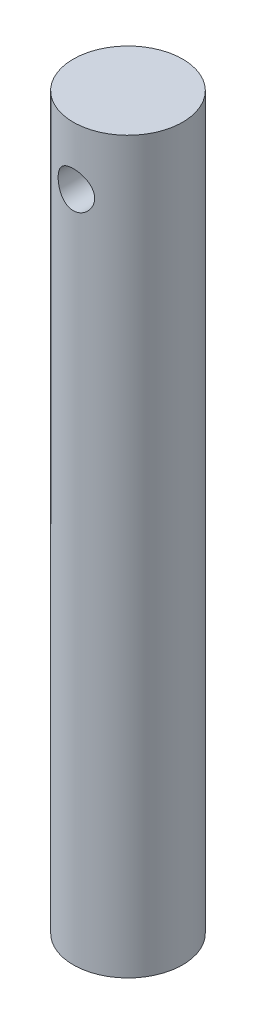
ISO-10303-21;
HEADER;
FILE_DESCRIPTION(('STEP AP214'),'2;1');
FILE_NAME('part.step','',(''),(''),'','','');
FILE_SCHEMA(('AUTOMOTIVE_DESIGN { 1 0 10303 214 1 1 1 1 }'));
ENDSEC;
DATA;
#1=APPLICATION_CONTEXT('core data for automotive mechanical design processes');
#2=APPLICATION_PROTOCOL_DEFINITION('international standard','automotive_design',2000,#1);
#3=PRODUCT_CONTEXT('',#1,'mechanical');
#4=PRODUCT('Part','Part','',(#3));
#5=PRODUCT_RELATED_PRODUCT_CATEGORY('part','',(#4));
#6=PRODUCT_DEFINITION_FORMATION('','',#4);
#7=PRODUCT_DEFINITION_CONTEXT('part definition',#1,'design');
#8=PRODUCT_DEFINITION('design','',#6,#7);
#9=PRODUCT_DEFINITION_SHAPE('','',#8);
#10=(LENGTH_UNIT() NAMED_UNIT(*) SI_UNIT(.MILLI.,.METRE.));
#11=(NAMED_UNIT(*) PLANE_ANGLE_UNIT() SI_UNIT($,.RADIAN.));
#12=(NAMED_UNIT(*) SI_UNIT($,.STERADIAN.) SOLID_ANGLE_UNIT());
#13=UNCERTAINTY_MEASURE_WITH_UNIT(LENGTH_MEASURE(1.E-05),#10,'distance_accuracy_value','');
#14=(GEOMETRIC_REPRESENTATION_CONTEXT(3) GLOBAL_UNCERTAINTY_ASSIGNED_CONTEXT((#13)) GLOBAL_UNIT_ASSIGNED_CONTEXT((#10,
#11,#12)) REPRESENTATION_CONTEXT('',''));
#15=CARTESIAN_POINT('',(0.,0.,0.));
#16=DIRECTION('',(0.,0.,1.));
#17=DIRECTION('',(1.,0.,0.));
#18=AXIS2_PLACEMENT_3D('',#15,#16,#17);
#19=CARTESIAN_POINT('',(0.,0.,0.));
#20=DIRECTION('',(0.,-1.,0.));
#21=DIRECTION('',(1.,0.,0.));
#22=AXIS2_PLACEMENT_3D('',#19,#20,#21);
#23=PLANE('',#22);
#24=CARTESIAN_POINT('',(0.,0.,0.));
#25=DIRECTION('',(0.,1.,0.));
#26=DIRECTION('',(-1.,0.,0.));
#27=AXIS2_PLACEMENT_3D('',#24,#25,#26);
#28=CIRCLE('',#27,4.75996);
#29=CARTESIAN_POINT('',(-4.75996000000002,0.,0.));
#30=VERTEX_POINT('',#29);
#31=EDGE_CURVE('E48',#30,#30,#28,.T.);
#32=ORIENTED_EDGE('',*,*,#31,.T.);
#33=EDGE_LOOP('',(#32));
#34=FACE_BOUND('',#33,.T.);
#35=ADVANCED_FACE('F34',(#34),#23,.F.);
#36=CARTESIAN_POINT('',(0.,0.,0.));
#37=DIRECTION('',(0.,1.,0.));
#38=DIRECTION('',(-1.,0.,0.));
#39=AXIS2_PLACEMENT_3D('',#36,#37,#38);
#40=CYLINDRICAL_SURFACE('',#39,4.75996);
#41=CARTESIAN_POINT('',(0.,-3.4925,-4.75996));
#42=CARTESIAN_POINT('',(-0.0866167195247513,-3.49249958799542,-4.7599602495705));
#43=CARTESIAN_POINT('',(-0.173230934056387,-3.49961198942618,-4.75757396727824));
#44=CARTESIAN_POINT('',(-0.343908018430015,-3.52778648720024,-4.74828970267775));
#45=CARTESIAN_POINT('',(-0.427970625172633,-3.54885001698566,-4.74139125675736));
#46=CARTESIAN_POINT('',(-0.591059224324681,-3.60412434674444,-4.72383219371372));
#47=CARTESIAN_POINT('',(-0.670093385121266,-3.63831315514545,-4.71317787203644));
#48=CARTESIAN_POINT('',(-0.821305793047321,-3.71876809951329,-4.6891944510313));
#49=CARTESIAN_POINT('',(-0.893482681657747,-3.76503662185925,-4.67586482331017));
#50=CARTESIAN_POINT('',(-1.03143379155772,-3.87002205547875,-4.64741669977021));
#51=CARTESIAN_POINT('',(-1.09693747308899,-3.92908276954941,-4.63225532156355));
#52=CARTESIAN_POINT('',(-1.21731714079682,-4.05724508793517,-4.60208831466731));
#53=CARTESIAN_POINT('',(-1.27219078327101,-4.12634890067978,-4.58708272101361));
#54=CARTESIAN_POINT('',(-1.3712978026377,-4.27507231678816,-4.55845430376394));
#55=CARTESIAN_POINT('',(-1.41517936666863,-4.35493739058951,-4.54488372719859));
#56=CARTESIAN_POINT('',(-1.48877256652655,-4.52143954417915,-4.52131393121735));
#57=CARTESIAN_POINT('',(-1.51848853179125,-4.60807454543762,-4.51131362085446));
#58=CARTESIAN_POINT('',(-1.56189187961738,-4.78258086082235,-4.49646821367011));
#59=CARTESIAN_POINT('',(-1.57608622515613,-4.87031184416575,-4.49146056836381));
#60=CARTESIAN_POINT('',(-1.58962821197511,-5.04704210546593,-4.48668672970883));
#61=CARTESIAN_POINT('',(-1.58898044686916,-5.13604098248901,-4.48691891463922));
#62=CARTESIAN_POINT('',(-1.57325020435077,-5.30845550222183,-4.49245606452615));
#63=CARTESIAN_POINT('',(-1.55882951805553,-5.39194028934832,-4.49752844722438));
#64=CARTESIAN_POINT('',(-1.51704244917971,-5.55522973151717,-4.51179386159576));
#65=CARTESIAN_POINT('',(-1.48967451508364,-5.6350339442448,-4.52098738711342));
#66=CARTESIAN_POINT('',(-1.42233688179104,-5.79019983815728,-4.54262483531957));
#67=CARTESIAN_POINT('',(-1.38217119234764,-5.8654691913205,-4.55511875572088));
#68=CARTESIAN_POINT('',(-1.2905142737802,-6.00840869279547,-4.58192831667857));
#69=CARTESIAN_POINT('',(-1.23901977052758,-6.07607663567356,-4.59624448337531));
#70=CARTESIAN_POINT('',(-1.12298918510662,-6.20561092260434,-4.62600031021356));
#71=CARTESIAN_POINT('',(-1.05791213451394,-6.26698917835125,-4.64145958257259));
#72=CARTESIAN_POINT('',(-0.91819858254943,-6.3780885737463,-4.67110522199185));
#73=CARTESIAN_POINT('',(-0.843561163463844,-6.42780859300466,-4.68529146662967));
#74=CARTESIAN_POINT('',(-0.685809471313347,-6.51457369214864,-4.71097921452677));
#75=CARTESIAN_POINT('',(-0.602618310734797,-6.55148786665215,-4.72245262894315));
#76=CARTESIAN_POINT('',(-0.430732846708632,-6.61064643917101,-4.74121802273391));
#77=CARTESIAN_POINT('',(-0.342040468782749,-6.63289593872829,-4.74851145612331));
#78=CARTESIAN_POINT('',(-0.16580213902212,-6.66122856605369,-4.75785418986708));
#79=CARTESIAN_POINT('',(-0.0783734075786698,-6.66797122761589,-4.7601172901641));
#80=CARTESIAN_POINT('',(0.0963837449657619,-6.66697768988067,-4.75978567339283));
#81=CARTESIAN_POINT('',(0.183712180522995,-6.65924393749343,-4.75719177728984));
#82=CARTESIAN_POINT('',(0.353149236983503,-6.63003888350566,-4.7475787263025));
#83=CARTESIAN_POINT('',(0.435335789761169,-6.60897251749676,-4.74069009912311));
#84=CARTESIAN_POINT('',(0.594974868737595,-6.55420662263395,-4.72331205407193));
#85=CARTESIAN_POINT('',(0.672426789656163,-6.52050548244946,-4.71282217694203));
#86=CARTESIAN_POINT('',(0.822670339360189,-6.44044337937334,-4.68896305455337));
#87=CARTESIAN_POINT('',(0.895285661765883,-6.39377256455262,-4.67552529290299));
#88=CARTESIAN_POINT('',(1.03186841501554,-6.28945991919544,-4.64729370008735));
#89=CARTESIAN_POINT('',(1.09583319199442,-6.2318147348775,-4.63249945509735));
#90=CARTESIAN_POINT('',(1.21632727414802,-6.1040883037758,-4.60236918705928));
#91=CARTESIAN_POINT('',(1.27238600285149,-6.03356064320417,-4.58703913115184));
#92=CARTESIAN_POINT('',(1.3719309367172,-5.88377055013686,-4.5582582795399));
#93=CARTESIAN_POINT('',(1.41541703393749,-5.80450804265648,-4.54480749997039));
#94=CARTESIAN_POINT('',(1.48838160645785,-5.63946177926065,-4.52143925554727));
#95=CARTESIAN_POINT('',(1.5178881412705,-5.55369149078483,-4.51151472298198));
#96=CARTESIAN_POINT('',(1.56190562078344,-5.37799198734181,-4.49646769151321));
#97=CARTESIAN_POINT('',(1.576423330516,-5.28806466776673,-4.49134302634229));
#98=CARTESIAN_POINT('',(1.58952315640421,-5.11157949703807,-4.48672247008384));
#99=CARTESIAN_POINT('',(1.58888641934569,-5.0250862074536,-4.48695065346133));
#100=CARTESIAN_POINT('',(1.57361821544084,-4.85350761799404,-4.49232778311328));
#101=CARTESIAN_POINT('',(1.55898758322144,-4.76842223445621,-4.49747643592));
#102=CARTESIAN_POINT('',(1.51670005140762,-4.60368622760059,-4.51190883125916));
#103=CARTESIAN_POINT('',(1.48929638922858,-4.52396298573912,-4.52111200280964));
#104=CARTESIAN_POINT('',(1.42244597018922,-4.37018495573297,-4.54258664843486));
#105=CARTESIAN_POINT('',(1.38299653837148,-4.29613143121358,-4.55485880391732));
#106=CARTESIAN_POINT('',(1.29116405090423,-4.15228934477753,-4.58175684726942));
#107=CARTESIAN_POINT('',(1.23829138132248,-4.08282829895615,-4.5964621235641));
#108=CARTESIAN_POINT('',(1.12194074304967,-3.95351228368728,-4.62623710837008));
#109=CARTESIAN_POINT('',(1.05845977427407,-3.89366004107635,-4.64130691893965));
#110=CARTESIAN_POINT('',(0.919719265237504,-3.78290604957769,-4.67081911104141));
#111=CARTESIAN_POINT('',(0.844096703668593,-3.73244482744334,-4.6852140457568));
#112=CARTESIAN_POINT('',(0.684968758642292,-3.64500529615142,-4.7111062779919));
#113=CARTESIAN_POINT('',(0.601465387389251,-3.60802355694443,-4.72260431243954));
#114=CARTESIAN_POINT('',(0.432750295008049,-3.55013712229937,-4.7409726922979));
#115=CARTESIAN_POINT('',(0.347778362268229,-3.528592461366,-4.74802557224235));
#116=CARTESIAN_POINT('',(0.175202941738251,-3.49977608549255,-4.75751846096947));
#117=CARTESIAN_POINT('',(0.0876001897687103,-3.4925004166826,-4.75995974759581));
#118=CARTESIAN_POINT('',(0.,-3.4925,-4.75996));
#119=B_SPLINE_CURVE_WITH_KNOTS('',3,(#41,#42,#43,#44,#45,#46,#47,#48,#49,#50,#51,#52,#53,#54,
#55,#56,#57,#58,#59,#60,#61,#62,#63,#64,#65,#66,#67,#68,#69,#70,#71,#72,#73,#74,#75,#76,#77,#78,
#79,#80,#81,#82,#83,#84,#85,#86,#87,#88,#89,#90,#91,#92,#93,#94,#95,#96,#97,#98,#99,#100,#101,
#102,#103,#104,#105,#106,#107,#108,#109,#110,#111,#112,#113,#114,#115,#116,#117,#118),
.UNSPECIFIED.,.T.,.F.,(4,2,2,2,2,2,2,2,2,2,2,2,2,2,2,2,2,2,2,2,2,2,2,2,2,2,2,2,2,2,2,2,2,2,2,2,
2,2,4),(0.,0.259527793077378,0.519082256097486,0.778203717034866,1.03737640688104,
1.3046475584383,1.571977570821,1.84700395271951,2.12194622421526,2.38761220063683,
2.65319595489767,2.90662838722251,3.16009119696727,3.41763899393394,3.67526132252981,
3.94634876125789,4.21746224159406,4.49127066865636,4.76498379299408,5.02682119937416,
5.2886143520624,5.54281471756854,5.79704751263995,6.05797151879716,6.31897539204019,
6.59185177974722,6.8647305101567,7.13705917848909,7.40926488063437,7.66747143550969,
7.92566259133403,8.1789394343194,8.43227256246703,8.69666969255752,8.96114172252486,
9.23593636013089,9.51066102336782,9.77320832784411,10.0356828714262),.UNSPECIFIED.);
#120=CARTESIAN_POINT('',(0.,-3.4925,-4.75996));
#121=VERTEX_POINT('',#120);
#122=EDGE_CURVE('E10',#121,#121,#119,.T.);
#123=ORIENTED_EDGE('',*,*,#122,.T.);
#124=EDGE_LOOP('',(#123));
#125=FACE_BOUND('',#124,.T.);
#126=CARTESIAN_POINT('',(1.58750000000002,-5.08000000000001,4.48743389384178));
#127=CARTESIAN_POINT('',(1.58750041901613,-5.16646528898974,4.48743360067506));
#128=CARTESIAN_POINT('',(1.58041195200963,-5.25292804294253,4.48996026463772));
#129=CARTESIAN_POINT('',(1.55234115930635,-5.42329181755565,4.49974132931377));
#130=CARTESIAN_POINT('',(1.53135655729154,-5.5071924161548,4.50699650459885));
#131=CARTESIAN_POINT('',(1.47631268883548,-5.66993624893454,4.52532338274428));
#132=CARTESIAN_POINT('',(1.4422790686933,-5.74878905143511,4.53638759506562));
#133=CARTESIAN_POINT('',(1.36219082839153,-5.8996912467871,4.56107498532142));
#134=CARTESIAN_POINT('',(1.31613355153163,-5.97173913125319,4.57469872861313));
#135=CARTESIAN_POINT('',(1.21137300267656,-6.1098083558927,4.60356856610916));
#136=CARTESIAN_POINT('',(1.15227829884873,-6.17552431006498,4.61885512232936));
#137=CARTESIAN_POINT('',(1.0239557297068,-6.2963213710826,4.64898617204141));
#138=CARTESIAN_POINT('',(0.954726238322307,-6.35140076805645,4.66383059413447));
#139=CARTESIAN_POINT('',(0.805865694398201,-6.45074725528349,4.69187334416678));
#140=CARTESIAN_POINT('',(0.726010170110219,-6.49469431946487,4.70501854306647));
#141=CARTESIAN_POINT('',(0.559526484950673,-6.5684110027263,4.72770494083655));
#142=CARTESIAN_POINT('',(0.472900158769256,-6.59818444704606,4.7372471119642));
#143=CARTESIAN_POINT('',(0.29853579439419,-6.64167297152234,4.75136569955225));
#144=CARTESIAN_POINT('',(0.210941548887595,-6.65591121193001,4.75610348704641));
#145=CARTESIAN_POINT('',(0.0344876629032518,-6.6695886702883,4.7606523316364));
#146=CARTESIAN_POINT('',(-0.0543716451660644,-6.66903170663425,4.76046465991123));
#147=CARTESIAN_POINT('',(-0.227130041675757,-6.65346628052013,4.75529305327101));
#148=CARTESIAN_POINT('',(-0.311086900701173,-6.63902607511876,4.75049771978295));
#149=CARTESIAN_POINT('',(-0.475309124115977,-6.5970438675882,4.73688643497004));
#150=CARTESIAN_POINT('',(-0.555574237843649,-6.56950097725032,4.72807021107755));
#151=CARTESIAN_POINT('',(-0.711376487491142,-6.50176372136684,4.70716767018348));
#152=CARTESIAN_POINT('',(-0.786837562895247,-6.46140773781979,4.69503987244329));
#153=CARTESIAN_POINT('',(-0.930084597418818,-6.36932311681637,4.66877639587625));
#154=CARTESIAN_POINT('',(-0.997868412771482,-6.31759131462653,4.65464015869301));
#155=CARTESIAN_POINT('',(-1.12721672796313,-6.20136058124893,4.62506348170808));
#156=CARTESIAN_POINT('',(-1.18833756305751,-6.13637485356465,4.60959297473389));
#157=CARTESIAN_POINT('',(-1.29895732759612,-5.99694446353938,4.5796529647333));
#158=CARTESIAN_POINT('',(-1.34845446197045,-5.92249834294441,4.56518361656078));
#159=CARTESIAN_POINT('',(-1.43503695119687,-5.76485298249514,4.53871955824774));
#160=CARTESIAN_POINT('',(-1.47193490243712,-5.6815438954696,4.52676315113148));
#161=CARTESIAN_POINT('',(-1.53102830126491,-5.50939596888282,4.5071224373186));
#162=CARTESIAN_POINT('',(-1.55322991857272,-5.42055946696281,4.49943633810684));
#163=CARTESIAN_POINT('',(-1.58139666250081,-5.24417622188188,4.48961218442888));
#164=CARTESIAN_POINT('',(-1.58804973108773,-5.15675239946922,4.48723926210829));
#165=CARTESIAN_POINT('',(-1.58687932965386,-4.98202354890091,4.48765362110394));
#166=CARTESIAN_POINT('',(-1.57905849259145,-4.89471850202986,4.49043996389467));
#167=CARTESIAN_POINT('',(-1.54978044443803,-4.72583683135346,4.50062474599677));
#168=CARTESIAN_POINT('',(-1.52880158304157,-4.64416646316483,4.50786123073396));
#169=CARTESIAN_POINT('',(-1.47437713038817,-4.48552163437658,4.52595271623477));
#170=CARTESIAN_POINT('',(-1.44092932755795,-4.40854800964224,4.53680835887988));
#171=CARTESIAN_POINT('',(-1.36130973104102,-4.25877374369565,4.56134169113666));
#172=CARTESIAN_POINT('',(-1.31476773765978,-4.18618312949783,4.57509802358186));
#173=CARTESIAN_POINT('',(-1.21070036339341,-4.04959342376906,4.60373020633471));
#174=CARTESIAN_POINT('',(-1.15317174143191,-3.98559687701659,4.61860638621298));
#175=CARTESIAN_POINT('',(-1.02547322604261,-3.86482569042789,4.6486689224333));
#176=CARTESIAN_POINT('',(-0.954827880877011,-3.80854743956438,4.6638357007562));
#177=CARTESIAN_POINT('',(-0.804723279416898,-3.70861228631785,4.69206385630603));
#178=CARTESIAN_POINT('',(-0.725264335343846,-3.66495493703723,4.7051253080739));
#179=CARTESIAN_POINT('',(-0.560182078071633,-3.59189971366162,4.7276104951375));
#180=CARTESIAN_POINT('',(-0.474603165103503,-3.56240914684847,4.73705779244405));
#181=CARTESIAN_POINT('',(-0.299323433658977,-3.51836000362626,4.75135168634006));
#182=CARTESIAN_POINT('',(-0.209624117070456,-3.50379603089208,4.7561999455459));
#183=CARTESIAN_POINT('',(-0.0331899843859098,-3.49049959435251,4.7606238756604));
#184=CARTESIAN_POINT('',(0.0534857621458701,-3.49105454665342,4.76043687315868));
#185=CARTESIAN_POINT('',(0.225451627864449,-3.50622211219349,4.75539576194101));
#186=CARTESIAN_POINT('',(0.31074185908902,-3.52083358295966,4.75054203252307));
#187=CARTESIAN_POINT('',(0.476164212907879,-3.56322662687217,4.73679991060405));
#188=CARTESIAN_POINT('',(0.556356823862811,-3.59079489700846,4.72797695913263));
#189=CARTESIAN_POINT('',(0.711009223283097,-3.65812140377505,4.70720508003958));
#190=CARTESIAN_POINT('',(0.785467971299834,-3.6978818462678,4.69525558680746));
#191=CARTESIAN_POINT('',(0.929540639056681,-3.79015630206549,4.66891173551945));
#192=CARTESIAN_POINT('',(0.99887363461907,-3.84308751096807,4.6544433168026));
#193=CARTESIAN_POINT('',(1.12790591237876,-3.95949149121739,4.62487161320186));
#194=CARTESIAN_POINT('',(1.18760210723625,-4.02296762767734,4.60976812680708));
#195=CARTESIAN_POINT('',(1.29804479660706,-4.16163472091291,4.57992400957194));
#196=CARTESIAN_POINT('',(1.34834874591846,-4.23718735145042,4.56522080963217));
#197=CARTESIAN_POINT('',(1.43551012390782,-4.39613167480638,4.53856997221889));
#198=CARTESIAN_POINT('',(1.47237104828587,-4.47952132259704,4.52662161867772));
#199=CARTESIAN_POINT('',(1.5300572426902,-4.64797388842188,4.5074418388187));
#200=CARTESIAN_POINT('',(1.55152753568383,-4.73279404138215,4.50002290115929));
#201=CARTESIAN_POINT('',(1.58024624165957,-4.90507761102967,4.49001991349651));
#202=CARTESIAN_POINT('',(1.58749957616397,-4.99254010236151,4.48743419038079));
#203=CARTESIAN_POINT('',(1.58750000000002,-5.08000000000001,4.48743389384178));
#204=B_SPLINE_CURVE_WITH_KNOTS('',3,(#126,#127,#128,#129,#130,#131,#132,#133,#134,#135,#136,
#137,#138,#139,#140,#141,#142,#143,#144,#145,#146,#147,#148,#149,#150,#151,#152,#153,#154,#155,
#156,#157,#158,#159,#160,#161,#162,#163,#164,#165,#166,#167,#168,#169,#170,#171,#172,#173,#174,
#175,#176,#177,#178,#179,#180,#181,#182,#183,#184,#185,#186,#187,#188,#189,#190,#191,#192,#193,
#194,#195,#196,#197,#198,#199,#200,#201,#202,#203),.UNSPECIFIED.,.T.,.F.,(4,2,2,2,2,2,2,2,2,2,2,
2,2,2,2,2,2,2,2,2,2,2,2,2,2,2,2,2,2,2,2,2,2,2,2,2,2,2,4),(0.,0.259071978071623,
0.518186405079132,0.776794162419339,1.0354591091558,1.30332163755787,1.57122719021317,
1.8461310319855,2.12096063936283,2.38621859079775,2.65140808424638,2.90618563918798,
3.16098046752784,3.41912614454468,3.67734372831176,3.94773078921585,4.2181595790815,
4.49245146172597,4.76662811976519,5.02842333380113,5.29017092916586,5.54291434146923,
5.79570260334788,6.05651523421177,6.31740492448196,6.5908619712373,6.86430933387735,
7.13594231254843,7.40747705464506,7.66623699402426,7.92497590392382,8.17959698536659,
8.43426416120401,8.69834741791347,8.96251511173388,9.23703789593959,9.51148924274641,
9.77363208379795,10.0356841621278),.UNSPECIFIED.);
#205=CARTESIAN_POINT('',(1.58750000000002,-5.08000000000001,4.48743389384178));
#206=VERTEX_POINT('',#205);
#207=EDGE_CURVE('E44',#206,#206,#204,.T.);
#208=ORIENTED_EDGE('',*,*,#207,.T.);
#209=EDGE_LOOP('',(#208));
#210=FACE_BOUND('',#209,.T.);
#211=ORIENTED_EDGE('',*,*,#31,.F.);
#212=EDGE_LOOP('',(#211));
#213=FACE_BOUND('',#212,.T.);
#214=CARTESIAN_POINT('',(0.,-63.5000000000002,0.));
#215=DIRECTION('',(0.,1.,0.));
#216=DIRECTION('',(-1.,0.,0.));
#217=AXIS2_PLACEMENT_3D('',#214,#215,#216);
#218=CIRCLE('',#217,4.75996);
#219=CARTESIAN_POINT('',(-4.75995999999994,-63.5000000000002,0.));
#220=VERTEX_POINT('',#219);
#221=EDGE_CURVE('E52',#220,#220,#218,.T.);
#222=ORIENTED_EDGE('',*,*,#221,.T.);
#223=EDGE_LOOP('',(#222));
#224=FACE_BOUND('',#223,.T.);
#225=ADVANCED_FACE('F58',(#125,#210,#213,#224),#40,.T.);
#226=CARTESIAN_POINT('',(0.,-63.5000000000002,0.));
#227=DIRECTION('',(0.,1.,0.));
#228=DIRECTION('',(-1.,0.,0.));
#229=AXIS2_PLACEMENT_3D('',#226,#227,#228);
#230=PLANE('',#229);
#231=ORIENTED_EDGE('',*,*,#221,.F.);
#232=EDGE_LOOP('',(#231));
#233=FACE_BOUND('',#232,.T.);
#234=ADVANCED_FACE('F64',(#233),#230,.F.);
#235=CARTESIAN_POINT('',(0.,-5.08000000000006,-4.75996));
#236=DIRECTION('',(0.,0.,1.));
#237=DIRECTION('',(1.,0.,0.));
#238=AXIS2_PLACEMENT_3D('',#235,#236,#237);
#239=CYLINDRICAL_SURFACE('',#238,1.5875);
#240=ORIENTED_EDGE('',*,*,#207,.F.);
#241=EDGE_LOOP('',(#240));
#242=FACE_BOUND('',#241,.T.);
#243=ORIENTED_EDGE('',*,*,#122,.F.);
#244=EDGE_LOOP('',(#243));
#245=FACE_BOUND('',#244,.T.);
#246=ADVANCED_FACE('F61',(#242,#245),#239,.F.);
#247=CLOSED_SHELL('',(#35,#225,#234,#246));
#248=MANIFOLD_SOLID_BREP('B2',#247);
#249=ADVANCED_BREP_SHAPE_REPRESENTATION('',(#18,#248),#14);
#250=SHAPE_DEFINITION_REPRESENTATION(#9,#249);
ENDSEC;
END-ISO-10303-21;
